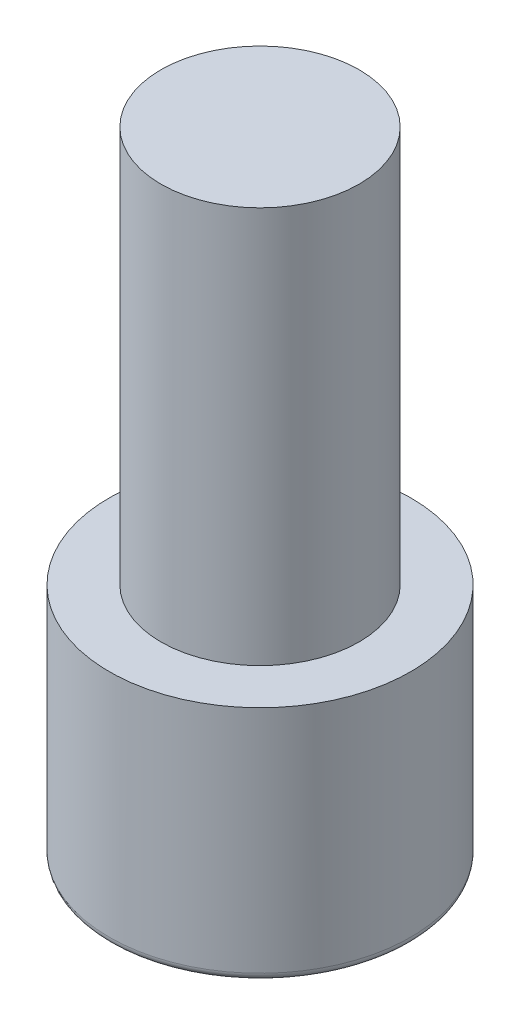
ISO-10303-21;
HEADER;
FILE_DESCRIPTION(('STEP AP214'),'2;1');
FILE_NAME('part.step','',(''),(''),'','','');
FILE_SCHEMA(('AUTOMOTIVE_DESIGN { 1 0 10303 214 1 1 1 1 }'));
ENDSEC;
DATA;
#1=APPLICATION_CONTEXT('core data for automotive mechanical design processes');
#2=APPLICATION_PROTOCOL_DEFINITION('international standard','automotive_design',2000,#1);
#3=PRODUCT_CONTEXT('',#1,'mechanical');
#4=PRODUCT('Part','Part','',(#3));
#5=PRODUCT_RELATED_PRODUCT_CATEGORY('part','',(#4));
#6=PRODUCT_DEFINITION_FORMATION('','',#4);
#7=PRODUCT_DEFINITION_CONTEXT('part definition',#1,'design');
#8=PRODUCT_DEFINITION('design','',#6,#7);
#9=PRODUCT_DEFINITION_SHAPE('','',#8);
#10=(LENGTH_UNIT() NAMED_UNIT(*) SI_UNIT(.MILLI.,.METRE.));
#11=(NAMED_UNIT(*) PLANE_ANGLE_UNIT() SI_UNIT($,.RADIAN.));
#12=(NAMED_UNIT(*) SI_UNIT($,.STERADIAN.) SOLID_ANGLE_UNIT());
#13=UNCERTAINTY_MEASURE_WITH_UNIT(LENGTH_MEASURE(1.E-05),#10,'distance_accuracy_value','');
#14=(GEOMETRIC_REPRESENTATION_CONTEXT(3) GLOBAL_UNCERTAINTY_ASSIGNED_CONTEXT((#13)) GLOBAL_UNIT_ASSIGNED_CONTEXT((#10,
#11,#12)) REPRESENTATION_CONTEXT('',''));
#15=CARTESIAN_POINT('',(0.,0.,0.));
#16=DIRECTION('',(0.,0.,1.));
#17=DIRECTION('',(1.,0.,0.));
#18=AXIS2_PLACEMENT_3D('',#15,#16,#17);
#19=CARTESIAN_POINT('',(0.,7.62,0.));
#20=DIRECTION('',(0.,1.,0.));
#21=DIRECTION('',(0.,0.,1.));
#22=AXIS2_PLACEMENT_3D('',#19,#20,#21);
#23=PLANE('',#22);
#24=CARTESIAN_POINT('',(0.,7.62,0.));
#25=DIRECTION('',(0.,1.,0.));
#26=DIRECTION('',(0.,0.,1.));
#27=AXIS2_PLACEMENT_3D('',#24,#25,#26);
#28=CIRCLE('',#27,4.826);
#29=CARTESIAN_POINT('',(0.,7.62,-4.826));
#30=VERTEX_POINT('',#29);
#31=EDGE_CURVE('E50',#30,#30,#28,.T.);
#32=ORIENTED_EDGE('',*,*,#31,.T.);
#33=EDGE_LOOP('',(#32));
#34=FACE_BOUND('',#33,.T.);
#35=CARTESIAN_POINT('',(0.,7.62,0.));
#36=DIRECTION('',(0.,1.,0.));
#37=DIRECTION('',(0.,0.,1.));
#38=AXIS2_PLACEMENT_3D('',#35,#36,#37);
#39=CIRCLE('',#38,3.175);
#40=CARTESIAN_POINT('',(0.,7.62,3.175));
#41=VERTEX_POINT('',#40);
#42=EDGE_CURVE('E58',#41,#41,#39,.T.);
#43=ORIENTED_EDGE('',*,*,#42,.F.);
#44=EDGE_LOOP('',(#43));
#45=FACE_BOUND('',#44,.T.);
#46=ADVANCED_FACE('F37',(#34,#45),#23,.T.);
#47=CARTESIAN_POINT('',(0.,7.62,0.));
#48=DIRECTION('',(0.,-1.,0.));
#49=DIRECTION('',(0.,0.,-1.));
#50=AXIS2_PLACEMENT_3D('',#47,#48,#49);
#51=CYLINDRICAL_SURFACE('',#50,4.826);
#52=CARTESIAN_POINT('',(0.,0.254,0.));
#53=DIRECTION('',(0.,1.,0.));
#54=DIRECTION('',(0.,0.,1.));
#55=AXIS2_PLACEMENT_3D('',#52,#53,#54);
#56=CIRCLE('',#55,4.826);
#57=CARTESIAN_POINT('',(0.,0.253999999999999,-4.826));
#58=VERTEX_POINT('',#57);
#59=EDGE_CURVE('E45',#58,#58,#56,.T.);
#60=CARTESIAN_POINT('',(0.,0.253999999999999,-4.826));
#61=CARTESIAN_POINT('',(0.,0.330729166666666,-4.826));
#62=CARTESIAN_POINT('',(0.,0.407458333333333,-4.826));
#63=CARTESIAN_POINT('',(0.,0.560916666666666,-4.826));
#64=CARTESIAN_POINT('',(0.,0.637645833333332,-4.826));
#65=CARTESIAN_POINT('',(0.,0.791104166666666,-4.826));
#66=CARTESIAN_POINT('',(0.,0.867833333333332,-4.826));
#67=CARTESIAN_POINT('',(0.,1.02129166666667,-4.826));
#68=CARTESIAN_POINT('',(0.,1.09802083333333,-4.826));
#69=CARTESIAN_POINT('',(0.,1.25147916666667,-4.826));
#70=CARTESIAN_POINT('',(0.,1.32820833333333,-4.826));
#71=CARTESIAN_POINT('',(0.,1.48166666666667,-4.826));
#72=CARTESIAN_POINT('',(0.,1.55839583333333,-4.826));
#73=CARTESIAN_POINT('',(0.,1.71185416666667,-4.826));
#74=CARTESIAN_POINT('',(0.,1.78858333333333,-4.826));
#75=CARTESIAN_POINT('',(0.,1.94204166666667,-4.826));
#76=CARTESIAN_POINT('',(0.,2.01877083333333,-4.826));
#77=CARTESIAN_POINT('',(0.,2.17222916666667,-4.826));
#78=CARTESIAN_POINT('',(0.,2.24895833333333,-4.826));
#79=CARTESIAN_POINT('',(0.,2.40241666666667,-4.826));
#80=CARTESIAN_POINT('',(0.,2.47914583333333,-4.826));
#81=CARTESIAN_POINT('',(0.,2.63260416666667,-4.826));
#82=CARTESIAN_POINT('',(0.,2.70933333333333,-4.826));
#83=CARTESIAN_POINT('',(0.,2.86279166666667,-4.826));
#84=CARTESIAN_POINT('',(0.,2.93952083333333,-4.826));
#85=CARTESIAN_POINT('',(0.,3.09297916666667,-4.826));
#86=CARTESIAN_POINT('',(0.,3.16970833333333,-4.826));
#87=CARTESIAN_POINT('',(0.,3.32316666666667,-4.826));
#88=CARTESIAN_POINT('',(0.,3.39989583333333,-4.826));
#89=CARTESIAN_POINT('',(0.,3.55335416666667,-4.826));
#90=CARTESIAN_POINT('',(0.,3.63008333333333,-4.826));
#91=CARTESIAN_POINT('',(0.,3.78354166666667,-4.826));
#92=CARTESIAN_POINT('',(0.,3.86027083333333,-4.826));
#93=CARTESIAN_POINT('',(0.,4.01372916666667,-4.826));
#94=CARTESIAN_POINT('',(0.,4.09045833333333,-4.826));
#95=CARTESIAN_POINT('',(0.,4.24391666666667,-4.826));
#96=CARTESIAN_POINT('',(0.,4.32064583333333,-4.826));
#97=CARTESIAN_POINT('',(0.,4.47410416666666,-4.826));
#98=CARTESIAN_POINT('',(0.,4.55083333333333,-4.826));
#99=CARTESIAN_POINT('',(0.,4.70429166666667,-4.826));
#100=CARTESIAN_POINT('',(0.,4.78102083333333,-4.826));
#101=CARTESIAN_POINT('',(0.,4.93447916666667,-4.826));
#102=CARTESIAN_POINT('',(0.,5.01120833333333,-4.826));
#103=CARTESIAN_POINT('',(0.,5.16466666666667,-4.826));
#104=CARTESIAN_POINT('',(0.,5.24139583333333,-4.826));
#105=CARTESIAN_POINT('',(0.,5.39485416666667,-4.826));
#106=CARTESIAN_POINT('',(0.,5.47158333333333,-4.826));
#107=CARTESIAN_POINT('',(0.,5.62504166666667,-4.826));
#108=CARTESIAN_POINT('',(0.,5.70177083333333,-4.826));
#109=CARTESIAN_POINT('',(0.,5.85522916666667,-4.826));
#110=CARTESIAN_POINT('',(0.,5.93195833333333,-4.826));
#111=CARTESIAN_POINT('',(0.,6.08541666666667,-4.826));
#112=CARTESIAN_POINT('',(0.,6.16214583333333,-4.826));
#113=CARTESIAN_POINT('',(0.,6.31560416666667,-4.826));
#114=CARTESIAN_POINT('',(0.,6.39233333333333,-4.826));
#115=CARTESIAN_POINT('',(0.,6.54579166666667,-4.826));
#116=CARTESIAN_POINT('',(0.,6.62252083333333,-4.826));
#117=CARTESIAN_POINT('',(0.,6.77597916666667,-4.826));
#118=CARTESIAN_POINT('',(0.,6.85270833333333,-4.826));
#119=CARTESIAN_POINT('',(0.,7.00616666666667,-4.826));
#120=CARTESIAN_POINT('',(0.,7.08289583333333,-4.826));
#121=CARTESIAN_POINT('',(0.,7.23635416666667,-4.826));
#122=CARTESIAN_POINT('',(0.,7.31308333333333,-4.826));
#123=CARTESIAN_POINT('',(0.,7.46654166666667,-4.826));
#124=CARTESIAN_POINT('',(0.,7.54327083333333,-4.826));
#125=CARTESIAN_POINT('',(0.,7.62,-4.826));
#126=B_SPLINE_CURVE_WITH_KNOTS('',3,(#60,#61,#62,#63,#64,#65,#66,#67,#68,#69,#70,#71,#72,#73,
#74,#75,#76,#77,#78,#79,#80,#81,#82,#83,#84,#85,#86,#87,#88,#89,#90,#91,#92,#93,#94,#95,#96,#97,
#98,#99,#100,#101,#102,#103,#104,#105,#106,#107,#108,#109,#110,#111,#112,#113,#114,#115,#116,
#117,#118,#119,#120,#121,#122,#123,#124,#125),.UNSPECIFIED.,.F.,.F.,(4,2,2,2,2,2,2,2,2,2,2,2,2,
2,2,2,2,2,2,2,2,2,2,2,2,2,2,2,2,2,2,2,4),(0.,0.2301875,0.460375,0.6905625,0.92075,1.1509375,
1.381125,1.6113125,1.8415,2.0716875,2.301875,2.5320625,2.76225,2.9924375,3.222625,3.4528125,
3.683,3.9131875,4.143375,4.3735625,4.60375,4.8339375,5.064125,5.2943125,5.5245,5.7546875,
5.984875,6.2150625,6.44525,6.6754375,6.905625,7.1358125,7.366),.UNSPECIFIED.);
#127=EDGE_CURVE('BSEAM76',#58,#30,#126,.T.);
#128=ORIENTED_EDGE('',*,*,#59,.T.);
#129=ORIENTED_EDGE('',*,*,#31,.F.);
#130=ORIENTED_EDGE('',*,*,#127,.T.);
#131=ORIENTED_EDGE('',*,*,#127,.F.);
#132=EDGE_LOOP('',(#128,#130,#129,#131));
#133=FACE_BOUND('',#132,.T.);
#134=ADVANCED_FACE('F76',(#133),#51,.T.);
#135=CARTESIAN_POINT('',(0.,0.,0.));
#136=DIRECTION('',(0.,1.,0.));
#137=DIRECTION('',(0.,0.,1.));
#138=AXIS2_PLACEMENT_3D('',#135,#136,#137);
#139=PLANE('',#138);
#140=CARTESIAN_POINT('',(0.,0.,0.));
#141=DIRECTION('',(0.,1.,0.));
#142=DIRECTION('',(0.,0.,1.));
#143=AXIS2_PLACEMENT_3D('',#140,#141,#142);
#144=CIRCLE('',#143,4.572);
#145=CARTESIAN_POINT('',(0.,0.,4.572));
#146=VERTEX_POINT('',#145);
#147=EDGE_CURVE('E10',#146,#146,#144,.F.);
#148=ORIENTED_EDGE('',*,*,#147,.T.);
#149=EDGE_LOOP('',(#148));
#150=FACE_BOUND('',#149,.T.);
#151=ADVANCED_FACE('F71',(#150),#139,.F.);
#152=CARTESIAN_POINT('',(0.,20.32,0.));
#153=DIRECTION('',(0.,-1.,0.));
#154=DIRECTION('',(0.,0.,-1.));
#155=AXIS2_PLACEMENT_3D('',#152,#153,#154);
#156=CYLINDRICAL_SURFACE('',#155,3.175);
#157=CARTESIAN_POINT('',(0.,20.32,0.));
#158=DIRECTION('',(0.,1.,0.));
#159=DIRECTION('',(0.,0.,1.));
#160=AXIS2_PLACEMENT_3D('',#157,#158,#159);
#161=CIRCLE('',#160,3.175);
#162=CARTESIAN_POINT('',(0.,20.32,3.175));
#163=VERTEX_POINT('',#162);
#164=EDGE_CURVE('E55',#163,#163,#161,.T.);
#165=ORIENTED_EDGE('',*,*,#164,.F.);
#166=EDGE_LOOP('',(#165));
#167=FACE_BOUND('',#166,.T.);
#168=ORIENTED_EDGE('',*,*,#42,.T.);
#169=EDGE_LOOP('',(#168));
#170=FACE_BOUND('',#169,.T.);
#171=ADVANCED_FACE('F68',(#167,#170),#156,.T.);
#172=CARTESIAN_POINT('',(0.,20.32,0.));
#173=DIRECTION('',(0.,1.,0.));
#174=DIRECTION('',(0.,0.,1.));
#175=AXIS2_PLACEMENT_3D('',#172,#173,#174);
#176=PLANE('',#175);
#177=ORIENTED_EDGE('',*,*,#164,.T.);
#178=EDGE_LOOP('',(#177));
#179=FACE_BOUND('',#178,.T.);
#180=ADVANCED_FACE('F66',(#179),#176,.T.);
#181=CARTESIAN_POINT('',(0.,0.254,0.));
#182=DIRECTION('',(0.,1.,0.));
#183=DIRECTION('',(0.,0.,1.));
#184=AXIS2_PLACEMENT_3D('',#181,#182,#183);
#185=TOROIDAL_SURFACE('',#184,4.572,0.254);
#186=ORIENTED_EDGE('',*,*,#147,.F.);
#187=EDGE_LOOP('',(#186));
#188=FACE_BOUND('',#187,.T.);
#189=ORIENTED_EDGE('',*,*,#59,.F.);
#190=EDGE_LOOP('',(#189));
#191=FACE_BOUND('',#190,.T.);
#192=ADVANCED_FACE('F39',(#188,#191),#185,.T.);
#193=CLOSED_SHELL('',(#46,#134,#151,#171,#180,#192));
#194=MANIFOLD_SOLID_BREP('B2',#193);
#195=ADVANCED_BREP_SHAPE_REPRESENTATION('',(#18,#194),#14);
#196=SHAPE_DEFINITION_REPRESENTATION(#9,#195);
ENDSEC;
END-ISO-10303-21;
